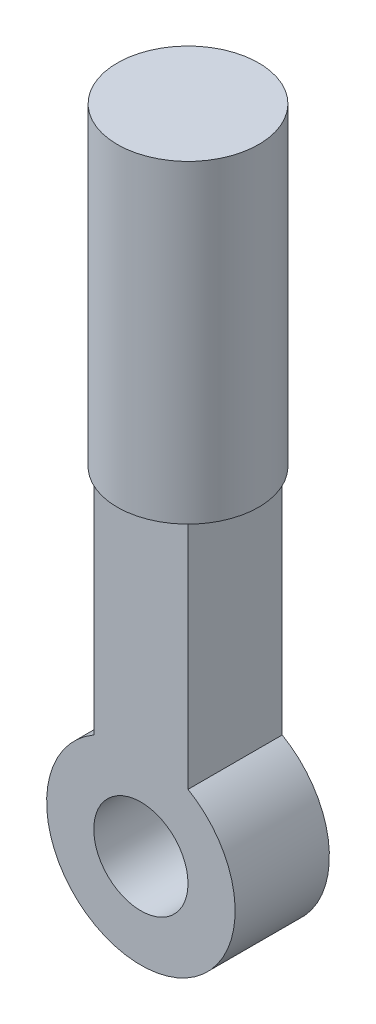
ISO-10303-21;
HEADER;
FILE_DESCRIPTION(('STEP AP214'),'2;1');
FILE_NAME('part.step','',(''),(''),'','','');
FILE_SCHEMA(('AUTOMOTIVE_DESIGN { 1 0 10303 214 1 1 1 1 }'));
ENDSEC;
DATA;
#1=APPLICATION_CONTEXT('core data for automotive mechanical design processes');
#2=APPLICATION_PROTOCOL_DEFINITION('international standard','automotive_design',2000,#1);
#3=PRODUCT_CONTEXT('',#1,'mechanical');
#4=PRODUCT('Part','Part','',(#3));
#5=PRODUCT_RELATED_PRODUCT_CATEGORY('part','',(#4));
#6=PRODUCT_DEFINITION_FORMATION('','',#4);
#7=PRODUCT_DEFINITION_CONTEXT('part definition',#1,'design');
#8=PRODUCT_DEFINITION('design','',#6,#7);
#9=PRODUCT_DEFINITION_SHAPE('','',#8);
#10=(LENGTH_UNIT() NAMED_UNIT(*) SI_UNIT(.MILLI.,.METRE.));
#11=(NAMED_UNIT(*) PLANE_ANGLE_UNIT() SI_UNIT($,.RADIAN.));
#12=(NAMED_UNIT(*) SI_UNIT($,.STERADIAN.) SOLID_ANGLE_UNIT());
#13=UNCERTAINTY_MEASURE_WITH_UNIT(LENGTH_MEASURE(1.E-05),#10,'distance_accuracy_value','');
#14=(GEOMETRIC_REPRESENTATION_CONTEXT(3) GLOBAL_UNCERTAINTY_ASSIGNED_CONTEXT((#13)) GLOBAL_UNIT_ASSIGNED_CONTEXT((#10,
#11,#12)) REPRESENTATION_CONTEXT('',''));
#15=CARTESIAN_POINT('',(0.,0.,0.));
#16=DIRECTION('',(0.,0.,1.));
#17=DIRECTION('',(1.,0.,0.));
#18=AXIS2_PLACEMENT_3D('',#15,#16,#17);
#19=CARTESIAN_POINT('',(0.,0.,3.));
#20=DIRECTION('',(0.,0.,1.));
#21=DIRECTION('',(1.,0.,0.));
#22=AXIS2_PLACEMENT_3D('',#19,#20,#21);
#23=PLANE('',#22);
#24=DIRECTION('',(0.,1.,0.));
#25=VECTOR('',#24,1.);
#26=CARTESIAN_POINT('',(1.5,10.,3.));
#27=LINE('',#26,#25);
#28=CARTESIAN_POINT('',(1.5,2.59807621135332,3.));
#29=VERTEX_POINT('',#28);
#30=CARTESIAN_POINT('',(1.5,10.,3.));
#31=VERTEX_POINT('',#30);
#32=EDGE_CURVE('E75',#29,#31,#27,.T.);
#33=ORIENTED_EDGE('',*,*,#32,.T.);
#34=DIRECTION('',(-1.,0.,0.));
#35=VECTOR('',#34,1.);
#36=CARTESIAN_POINT('',(1.5,10.,3.));
#37=LINE('',#36,#35);
#38=CARTESIAN_POINT('',(-1.5,10.,3.));
#39=VERTEX_POINT('',#38);
#40=EDGE_CURVE('E96',#31,#39,#37,.T.);
#41=ORIENTED_EDGE('',*,*,#40,.T.);
#42=DIRECTION('',(0.,-1.,0.));
#43=VECTOR('',#42,1.);
#44=CARTESIAN_POINT('',(-1.5,10.,3.));
#45=LINE('',#44,#43);
#46=CARTESIAN_POINT('',(-1.5,2.59807621135332,3.));
#47=VERTEX_POINT('',#46);
#48=EDGE_CURVE('E98',#39,#47,#45,.T.);
#49=ORIENTED_EDGE('',*,*,#48,.T.);
#50=CARTESIAN_POINT('',(0.,0.,3.));
#51=DIRECTION('',(0.,0.,1.));
#52=DIRECTION('',(1.,0.,0.));
#53=AXIS2_PLACEMENT_3D('',#50,#51,#52);
#54=CIRCLE('',#53,3.);
#55=EDGE_CURVE('E50',#47,#29,#54,.T.);
#56=ORIENTED_EDGE('',*,*,#55,.T.);
#57=EDGE_LOOP('',(#33,#41,#49,#56));
#58=FACE_BOUND('',#57,.T.);
#59=CARTESIAN_POINT('',(0.,0.,3.));
#60=DIRECTION('',(0.,0.,1.));
#61=DIRECTION('',(1.,0.,0.));
#62=AXIS2_PLACEMENT_3D('',#59,#60,#61);
#63=CIRCLE('',#62,1.5);
#64=CARTESIAN_POINT('',(1.5,0.,3.));
#65=VERTEX_POINT('',#64);
#66=EDGE_CURVE('E87',#65,#65,#63,.T.);
#67=ORIENTED_EDGE('',*,*,#66,.F.);
#68=EDGE_LOOP('',(#67));
#69=FACE_BOUND('',#68,.T.);
#70=ADVANCED_FACE('F33',(#58,#69),#23,.T.);
#71=CARTESIAN_POINT('',(0.,0.,0.));
#72=DIRECTION('',(0.,0.,1.));
#73=DIRECTION('',(1.,0.,0.));
#74=AXIS2_PLACEMENT_3D('',#71,#72,#73);
#75=PLANE('',#74);
#76=DIRECTION('',(0.,1.,0.));
#77=VECTOR('',#76,1.);
#78=CARTESIAN_POINT('',(1.5,10.,0.));
#79=LINE('',#78,#77);
#80=CARTESIAN_POINT('',(1.5,2.59807621135332,0.));
#81=VERTEX_POINT('',#80);
#82=CARTESIAN_POINT('',(1.5,10.,0.));
#83=VERTEX_POINT('',#82);
#84=EDGE_CURVE('E81',#81,#83,#79,.T.);
#85=ORIENTED_EDGE('',*,*,#84,.F.);
#86=CARTESIAN_POINT('',(0.,0.,0.));
#87=DIRECTION('',(0.,0.,1.));
#88=DIRECTION('',(1.,0.,0.));
#89=AXIS2_PLACEMENT_3D('',#86,#87,#88);
#90=CIRCLE('',#89,3.);
#91=CARTESIAN_POINT('',(-1.5,2.59807621135332,0.));
#92=VERTEX_POINT('',#91);
#93=EDGE_CURVE('E70',#92,#81,#90,.T.);
#94=ORIENTED_EDGE('',*,*,#93,.F.);
#95=DIRECTION('',(0.,-1.,0.));
#96=VECTOR('',#95,1.);
#97=CARTESIAN_POINT('',(-1.5,10.,0.));
#98=LINE('',#97,#96);
#99=CARTESIAN_POINT('',(-1.5,10.,0.));
#100=VERTEX_POINT('',#99);
#101=EDGE_CURVE('E64',#100,#92,#98,.T.);
#102=ORIENTED_EDGE('',*,*,#101,.F.);
#103=DIRECTION('',(-1.,0.,0.));
#104=VECTOR('',#103,1.);
#105=CARTESIAN_POINT('',(1.5,10.,0.));
#106=LINE('',#105,#104);
#107=EDGE_CURVE('E86',#83,#100,#106,.T.);
#108=ORIENTED_EDGE('',*,*,#107,.F.);
#109=EDGE_LOOP('',(#85,#94,#102,#108));
#110=FACE_BOUND('',#109,.T.);
#111=CARTESIAN_POINT('',(0.,0.,0.));
#112=DIRECTION('',(0.,0.,1.));
#113=DIRECTION('',(1.,0.,0.));
#114=AXIS2_PLACEMENT_3D('',#111,#112,#113);
#115=CIRCLE('',#114,1.5);
#116=CARTESIAN_POINT('',(1.5,0.,0.));
#117=VERTEX_POINT('',#116);
#118=EDGE_CURVE('E116',#117,#117,#115,.T.);
#119=ORIENTED_EDGE('',*,*,#118,.T.);
#120=EDGE_LOOP('',(#119));
#121=FACE_BOUND('',#120,.T.);
#122=ADVANCED_FACE('F90',(#110,#121),#75,.F.);
#123=CARTESIAN_POINT('',(1.5,10.,3.));
#124=DIRECTION('',(-1.,0.,0.));
#125=DIRECTION('',(0.,-1.,0.));
#126=AXIS2_PLACEMENT_3D('',#123,#124,#125);
#127=PLANE('',#126);
#128=ORIENTED_EDGE('',*,*,#84,.T.);
#129=DIRECTION('',(0.,0.,-1.));
#130=VECTOR('',#129,1.);
#131=CARTESIAN_POINT('',(1.5,10.,3.));
#132=LINE('',#131,#130);
#133=EDGE_CURVE('E11',#31,#83,#132,.T.);
#134=ORIENTED_EDGE('',*,*,#133,.F.);
#135=ORIENTED_EDGE('',*,*,#32,.F.);
#136=DIRECTION('',(0.,0.,-1.));
#137=VECTOR('',#136,1.);
#138=CARTESIAN_POINT('',(1.5,2.59807621135332,3.));
#139=LINE('',#138,#137);
#140=EDGE_CURVE('E84',#29,#81,#139,.T.);
#141=ORIENTED_EDGE('',*,*,#140,.T.);
#142=EDGE_LOOP('',(#128,#134,#135,#141));
#143=FACE_BOUND('',#142,.T.);
#144=ADVANCED_FACE('F35',(#143),#127,.F.);
#145=CARTESIAN_POINT('',(-1.5,10.,3.));
#146=DIRECTION('',(1.,0.,0.));
#147=DIRECTION('',(0.,1.,0.));
#148=AXIS2_PLACEMENT_3D('',#145,#146,#147);
#149=PLANE('',#148);
#150=ORIENTED_EDGE('',*,*,#101,.T.);
#151=DIRECTION('',(0.,0.,-1.));
#152=VECTOR('',#151,1.);
#153=CARTESIAN_POINT('',(-1.5,2.59807621135332,3.));
#154=LINE('',#153,#152);
#155=EDGE_CURVE('E108',#47,#92,#154,.T.);
#156=ORIENTED_EDGE('',*,*,#155,.F.);
#157=ORIENTED_EDGE('',*,*,#48,.F.);
#158=DIRECTION('',(0.,0.,-1.));
#159=VECTOR('',#158,1.);
#160=CARTESIAN_POINT('',(-1.5,10.,3.));
#161=LINE('',#160,#159);
#162=EDGE_CURVE('E42',#39,#100,#161,.T.);
#163=ORIENTED_EDGE('',*,*,#162,.T.);
#164=EDGE_LOOP('',(#150,#156,#157,#163));
#165=FACE_BOUND('',#164,.T.);
#166=ADVANCED_FACE('F109',(#165),#149,.F.);
#167=CARTESIAN_POINT('',(0.,0.,3.));
#168=DIRECTION('',(0.,0.,-1.));
#169=DIRECTION('',(-1.,0.,0.));
#170=AXIS2_PLACEMENT_3D('',#167,#168,#169);
#171=CYLINDRICAL_SURFACE('',#170,3.);
#172=ORIENTED_EDGE('',*,*,#93,.T.);
#173=ORIENTED_EDGE('',*,*,#140,.F.);
#174=ORIENTED_EDGE('',*,*,#55,.F.);
#175=ORIENTED_EDGE('',*,*,#155,.T.);
#176=EDGE_LOOP('',(#172,#173,#174,#175));
#177=FACE_BOUND('',#176,.T.);
#178=ADVANCED_FACE('F141',(#177),#171,.T.);
#179=CARTESIAN_POINT('',(0.,0.,3.));
#180=DIRECTION('',(0.,0.,-1.));
#181=DIRECTION('',(-1.,0.,0.));
#182=AXIS2_PLACEMENT_3D('',#179,#180,#181);
#183=CYLINDRICAL_SURFACE('',#182,1.5);
#184=ORIENTED_EDGE('',*,*,#66,.T.);
#185=EDGE_LOOP('',(#184));
#186=FACE_BOUND('',#185,.T.);
#187=ORIENTED_EDGE('',*,*,#118,.F.);
#188=EDGE_LOOP('',(#187));
#189=FACE_BOUND('',#188,.T.);
#190=ADVANCED_FACE('F136',(#186,#189),#183,.F.);
#191=CARTESIAN_POINT('',(0.,10.,1.5));
#192=DIRECTION('',(0.,1.,0.));
#193=DIRECTION('',(0.,0.,1.));
#194=AXIS2_PLACEMENT_3D('',#191,#192,#193);
#195=PLANE('',#194);
#196=CARTESIAN_POINT('',(0.,10.,1.5));
#197=DIRECTION('',(0.,1.,0.));
#198=DIRECTION('',(0.,0.,1.));
#199=AXIS2_PLACEMENT_3D('',#196,#197,#198);
#200=CIRCLE('',#199,2.25);
#201=CARTESIAN_POINT('',(0.,10.,3.75));
#202=VERTEX_POINT('',#201);
#203=EDGE_CURVE('E121',#202,#202,#200,.T.);
#204=ORIENTED_EDGE('',*,*,#203,.F.);
#205=EDGE_LOOP('',(#204));
#206=FACE_BOUND('',#205,.T.);
#207=ORIENTED_EDGE('',*,*,#133,.T.);
#208=ORIENTED_EDGE('',*,*,#107,.T.);
#209=ORIENTED_EDGE('',*,*,#162,.F.);
#210=ORIENTED_EDGE('',*,*,#40,.F.);
#211=EDGE_LOOP('',(#207,#208,#209,#210));
#212=FACE_BOUND('',#211,.T.);
#213=ADVANCED_FACE('F95',(#206,#212),#195,.F.);
#214=CARTESIAN_POINT('',(0.,20.,1.5));
#215=DIRECTION('',(0.,-1.,0.));
#216=DIRECTION('',(0.,0.,-1.));
#217=AXIS2_PLACEMENT_3D('',#214,#215,#216);
#218=CYLINDRICAL_SURFACE('',#217,2.25);
#219=CARTESIAN_POINT('',(0.,20.,1.5));
#220=DIRECTION('',(0.,1.,0.));
#221=DIRECTION('',(0.,0.,1.));
#222=AXIS2_PLACEMENT_3D('',#219,#220,#221);
#223=CIRCLE('',#222,2.25);
#224=CARTESIAN_POINT('',(0.,20.,3.75));
#225=VERTEX_POINT('',#224);
#226=EDGE_CURVE('E119',#225,#225,#223,.T.);
#227=ORIENTED_EDGE('',*,*,#226,.F.);
#228=EDGE_LOOP('',(#227));
#229=FACE_BOUND('',#228,.T.);
#230=ORIENTED_EDGE('',*,*,#203,.T.);
#231=EDGE_LOOP('',(#230));
#232=FACE_BOUND('',#231,.T.);
#233=ADVANCED_FACE('F129',(#229,#232),#218,.T.);
#234=CARTESIAN_POINT('',(0.,20.,1.5));
#235=DIRECTION('',(0.,1.,0.));
#236=DIRECTION('',(0.,0.,1.));
#237=AXIS2_PLACEMENT_3D('',#234,#235,#236);
#238=PLANE('',#237);
#239=ORIENTED_EDGE('',*,*,#226,.T.);
#240=EDGE_LOOP('',(#239));
#241=FACE_BOUND('',#240,.T.);
#242=ADVANCED_FACE('F127',(#241),#238,.T.);
#243=CLOSED_SHELL('',(#70,#122,#144,#166,#178,#190,#213,#233,#242));
#244=MANIFOLD_SOLID_BREP('B2',#243);
#245=ADVANCED_BREP_SHAPE_REPRESENTATION('',(#18,#244),#14);
#246=SHAPE_DEFINITION_REPRESENTATION(#9,#245);
ENDSEC;
END-ISO-10303-21;
